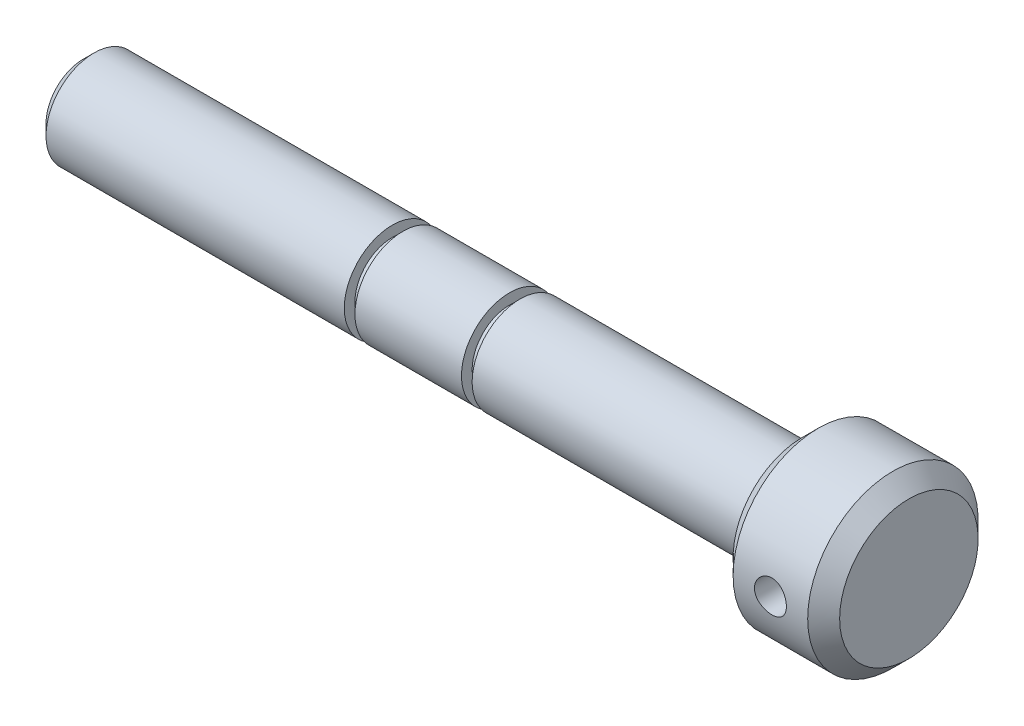
ISO-10303-21;
HEADER;
FILE_DESCRIPTION(('STEP AP214'),'2;1');
FILE_NAME('part.step','',(''),(''),'','','');
FILE_SCHEMA(('AUTOMOTIVE_DESIGN { 1 0 10303 214 1 1 1 1 }'));
ENDSEC;
DATA;
#1=APPLICATION_CONTEXT('core data for automotive mechanical design processes');
#2=APPLICATION_PROTOCOL_DEFINITION('international standard','automotive_design',2000,#1);
#3=PRODUCT_CONTEXT('',#1,'mechanical');
#4=PRODUCT('Part','Part','',(#3));
#5=PRODUCT_RELATED_PRODUCT_CATEGORY('part','',(#4));
#6=PRODUCT_DEFINITION_FORMATION('','',#4);
#7=PRODUCT_DEFINITION_CONTEXT('part definition',#1,'design');
#8=PRODUCT_DEFINITION('design','',#6,#7);
#9=PRODUCT_DEFINITION_SHAPE('','',#8);
#10=(LENGTH_UNIT() NAMED_UNIT(*) SI_UNIT(.MILLI.,.METRE.));
#11=(NAMED_UNIT(*) PLANE_ANGLE_UNIT() SI_UNIT($,.RADIAN.));
#12=(NAMED_UNIT(*) SI_UNIT($,.STERADIAN.) SOLID_ANGLE_UNIT());
#13=UNCERTAINTY_MEASURE_WITH_UNIT(LENGTH_MEASURE(1.E-05),#10,'distance_accuracy_value','');
#14=(GEOMETRIC_REPRESENTATION_CONTEXT(3) GLOBAL_UNCERTAINTY_ASSIGNED_CONTEXT((#13)) GLOBAL_UNIT_ASSIGNED_CONTEXT((#10,
#11,#12)) REPRESENTATION_CONTEXT('',''));
#15=CARTESIAN_POINT('',(0.,0.,0.));
#16=DIRECTION('',(0.,0.,1.));
#17=DIRECTION('',(1.,0.,0.));
#18=AXIS2_PLACEMENT_3D('',#15,#16,#17);
#19=CARTESIAN_POINT('',(155.,0.,0.));
#20=DIRECTION('',(-1.,0.,0.));
#21=DIRECTION('',(0.,0.,1.));
#22=AXIS2_PLACEMENT_3D('',#19,#20,#21);
#23=PLANE('',#22);
#24=CARTESIAN_POINT('',(155.,0.,0.));
#25=DIRECTION('',(-1.,0.,0.));
#26=DIRECTION('',(0.,0.,1.));
#27=AXIS2_PLACEMENT_3D('',#24,#25,#26);
#28=CIRCLE('',#27,13.);
#29=CARTESIAN_POINT('',(155.,0.,13.));
#30=VERTEX_POINT('',#29);
#31=EDGE_CURVE('E58',#30,#30,#28,.F.);
#32=ORIENTED_EDGE('',*,*,#31,.T.);
#33=EDGE_LOOP('',(#32));
#34=FACE_BOUND('',#33,.T.);
#35=ADVANCED_FACE('F39',(#34),#23,.F.);
#36=CARTESIAN_POINT('',(0.,0.,0.));
#37=DIRECTION('',(-1.,0.,0.));
#38=DIRECTION('',(0.,0.,1.));
#39=AXIS2_PLACEMENT_3D('',#36,#37,#38);
#40=CYLINDRICAL_SURFACE('',#39,16.);
#41=CARTESIAN_POINT('',(148.,0.,16.));
#42=CARTESIAN_POINT('',(147.999993620823,-0.16694349293094,15.999996976677));
#43=CARTESIAN_POINT('',(147.986017846761,-0.333969985460194,15.9973601984343));
#44=CARTESIAN_POINT('',(147.930520009763,-0.663316259683594,15.9870957178104));
#45=CARTESIAN_POINT('',(147.888974698721,-0.825631948304452,15.9794638033379));
#46=CARTESIAN_POINT('',(147.779654597481,-1.14074592370361,15.9600627753092));
#47=CARTESIAN_POINT('',(147.711903495095,-1.2935526613707,15.9482973989297));
#48=CARTESIAN_POINT('',(147.552162246154,-1.58561594618802,15.9219142119957));
#49=CARTESIAN_POINT('',(147.46017406171,-1.72487358895465,15.9072966323658));
#50=CARTESIAN_POINT('',(147.253400463993,-1.987567431861,15.8766267286101));
#51=CARTESIAN_POINT('',(147.13838111066,-2.11081791006366,15.860560697127));
#52=CARTESIAN_POINT('',(146.889313381825,-2.33639212270738,15.828906369173));
#53=CARTESIAN_POINT('',(146.755263640461,-2.43871435378483,15.8133181070905));
#54=CARTESIAN_POINT('',(146.470627823272,-2.62029997331585,15.7842510249001));
#55=CARTESIAN_POINT('',(146.319919259366,-2.6993744393921,15.7707898777236));
#56=CARTESIAN_POINT('',(146.007062169646,-2.83101048664565,15.7476942642397));
#57=CARTESIAN_POINT('',(145.844914631778,-2.88357435426196,15.7380594679392));
#58=CARTESIAN_POINT('',(145.515769538171,-2.96010107007,15.723845391491));
#59=CARTESIAN_POINT('',(145.348849805593,-2.98438780384078,15.7192089073281));
#60=CARTESIAN_POINT('',(145.013245230383,-3.00467616190692,15.7153439430552));
#61=CARTESIAN_POINT('',(144.844560547395,-3.00068032270747,15.7161149779752));
#62=CARTESIAN_POINT('',(144.512560949468,-2.96477959204724,15.7229258540351));
#63=CARTESIAN_POINT('',(144.3492045714,-2.93324299992089,15.7288961629467));
#64=CARTESIAN_POINT('',(144.030143160435,-2.84373598792413,15.7453236656933));
#65=CARTESIAN_POINT('',(143.874438452981,-2.78576444478997,15.7557810501903));
#66=CARTESIAN_POINT('',(143.574022641999,-2.64467294358598,15.7800771058518));
#67=CARTESIAN_POINT('',(143.429383058838,-2.5614042706491,15.7939356764673));
#68=CARTESIAN_POINT('',(143.15599054292,-2.37218737860831,15.8234594320584));
#69=CARTESIAN_POINT('',(143.02723922457,-2.26623685778531,15.8391248003104));
#70=CARTESIAN_POINT('',(142.787150088655,-2.03267811370594,15.8708000254433));
#71=CARTESIAN_POINT('',(142.676118695097,-1.90475487372135,15.8868114204806));
#72=CARTESIAN_POINT('',(142.477045518649,-1.63193607419765,15.9171477221664));
#73=CARTESIAN_POINT('',(142.389003966259,-1.48704034451154,15.9314726119049));
#74=CARTESIAN_POINT('',(142.23836449226,-1.18406997774934,15.9568507935502));
#75=CARTESIAN_POINT('',(142.175798441764,-1.02597912889299,15.9678999827258));
#76=CARTESIAN_POINT('',(142.078195813816,-0.701278230797388,15.9854501080544));
#77=CARTESIAN_POINT('',(142.043156311909,-0.534669088555567,15.9919515273599));
#78=CARTESIAN_POINT('',(142.002027937963,-0.200297305806762,15.9996072128396));
#79=CARTESIAN_POINT('',(141.995519216941,-0.0325880252682624,16.0008390182456));
#80=CARTESIAN_POINT('',(142.010510959095,0.301522496184375,15.9980308719646));
#81=CARTESIAN_POINT('',(142.03201004613,0.467923800960776,15.9939911792886));
#82=CARTESIAN_POINT('',(142.102058070367,0.793363146436439,15.9811422300081));
#83=CARTESIAN_POINT('',(142.150394565076,0.952448522092132,15.9723704474806));
#84=CARTESIAN_POINT('',(142.272515413558,1.26025726364927,15.95103684425));
#85=CARTESIAN_POINT('',(142.346301495132,1.40897992519021,15.9384747662267));
#86=CARTESIAN_POINT('',(142.518156256319,1.69363334302643,15.9107606071533));
#87=CARTESIAN_POINT('',(142.616481477074,1.82940655403025,15.8955817234913));
#88=CARTESIAN_POINT('',(142.834276274725,2.0826766465291,15.8643868697942));
#89=CARTESIAN_POINT('',(142.953747826003,2.20017181952174,15.8483708216937));
#90=CARTESIAN_POINT('',(143.212344637823,2.41514591744096,15.817049513949));
#91=CARTESIAN_POINT('',(143.351709816251,2.51233832437154,15.8017565172051));
#92=CARTESIAN_POINT('',(143.645035249048,2.68193350115574,15.7738597115706));
#93=CARTESIAN_POINT('',(143.798994960741,2.75433719227848,15.761255802747));
#94=CARTESIAN_POINT('',(144.116411734485,2.87189347025646,15.7402604841915));
#95=CARTESIAN_POINT('',(144.279818759119,2.91717737589572,15.7318488087376));
#96=CARTESIAN_POINT('',(144.612094445043,2.97961358652471,15.7201440760483));
#97=CARTESIAN_POINT('',(144.780962487941,2.99676906541416,15.7168504413158));
#98=CARTESIAN_POINT('',(145.116496662883,3.00235524296709,15.7157839960771));
#99=CARTESIAN_POINT('',(145.283155161914,2.99123790006997,15.7179243194859));
#100=CARTESIAN_POINT('',(145.612182844091,2.94158350757605,15.7272920132));
#101=CARTESIAN_POINT('',(145.774552052855,2.90304662178663,15.7345193531149));
#102=CARTESIAN_POINT('',(146.090148969591,2.79983775166526,15.7532101604636));
#103=CARTESIAN_POINT('',(146.243393182692,2.73521470794505,15.7646656918993));
#104=CARTESIAN_POINT('',(146.536936508482,2.58171737824409,15.7905277510368));
#105=CARTESIAN_POINT('',(146.67723470569,2.49284137896372,15.8049344872024));
#106=CARTESIAN_POINT('',(146.943167360085,2.29178974679071,15.8353453221549));
#107=CARTESIAN_POINT('',(147.068550825134,2.17928519728607,15.8513701070609));
#108=CARTESIAN_POINT('',(147.298810324929,1.93485585348458,15.8830566783747));
#109=CARTESIAN_POINT('',(147.40368164196,1.80292660378324,15.8987183805466));
#110=CARTESIAN_POINT('',(147.590821905254,1.52196989014375,15.928079519361));
#111=CARTESIAN_POINT('',(147.672878856981,1.37279918128104,15.9417600198112));
#112=CARTESIAN_POINT('',(147.81063527321,1.06258022730767,15.9654323876137));
#113=CARTESIAN_POINT('',(147.866359494094,0.901543303410504,15.9754277175807));
#114=CARTESIAN_POINT('',(147.938554628837,0.616694405650313,15.9885658141526));
#115=CARTESIAN_POINT('',(147.961557260626,0.494547620503744,15.9928294175641));
#116=CARTESIAN_POINT('',(147.992282124233,0.248282494230316,15.9985475990802));
#117=CARTESIAN_POINT('',(148.000004744512,0.124164203305419,16.0000022485961));
#118=CARTESIAN_POINT('',(148.,0.,16.));
#119=B_SPLINE_CURVE_WITH_KNOTS('',3,(#41,#42,#43,#44,#45,#46,#47,#48,#49,#50,#51,#52,#53,#54,
#55,#56,#57,#58,#59,#60,#61,#62,#63,#64,#65,#66,#67,#68,#69,#70,#71,#72,#73,#74,#75,#76,#77,#78,
#79,#80,#81,#82,#83,#84,#85,#86,#87,#88,#89,#90,#91,#92,#93,#94,#95,#96,#97,#98,#99,#100,#101,
#102,#103,#104,#105,#106,#107,#108,#109,#110,#111,#112,#113,#114,#115,#116,#117,#118),
.UNSPECIFIED.,.T.,.F.,(4,2,2,2,2,2,2,2,2,2,2,2,2,2,2,2,2,2,2,2,2,2,2,2,2,2,2,2,2,2,2,2,2,2,2,2,
2,2,4),(0.,0.500376401929849,1.00117528507091,1.50152254246183,2.00182930673783,2.5075023602726,
3.01321172567233,3.52292381008715,4.03259192623896,4.53636302890675,5.04008895174515,
5.53718001225533,6.03429219693573,6.5343852525906,7.03452908099719,7.54255536928153,
8.05058675089894,8.55925176643395,9.0678627334749,9.56896348152192,10.0700396092917,
10.5672046781566,11.0644035067606,11.5670355603542,12.069714568262,12.579068739746,
13.0884039790989,13.5952525563712,14.1020439389303,14.6007850446349,15.0995231708301,
15.5973299241538,16.0951718531084,16.6004673993276,17.1058790252451,17.6158409783262,
18.1253225386234,18.4974868904881,18.8696417807908),.UNSPECIFIED.);
#120=CARTESIAN_POINT('',(148.,0.,16.));
#121=VERTEX_POINT('',#120);
#122=EDGE_CURVE('E44',#121,#121,#119,.T.);
#123=ORIENTED_EDGE('',*,*,#122,.T.);
#124=EDGE_LOOP('',(#123));
#125=FACE_BOUND('',#124,.T.);
#126=CARTESIAN_POINT('',(148.,0.,-16.));
#127=CARTESIAN_POINT('',(147.999993620823,0.166943492930942,-15.999996976677));
#128=CARTESIAN_POINT('',(147.986017846761,0.333969985460198,-15.9973601984343));
#129=CARTESIAN_POINT('',(147.930520009763,0.663316259683596,-15.9870957178104));
#130=CARTESIAN_POINT('',(147.888974698721,0.825631948304452,-15.9794638033379));
#131=CARTESIAN_POINT('',(147.779654597481,1.1407459237036,-15.9600627753092));
#132=CARTESIAN_POINT('',(147.711903495095,1.29355266137068,-15.9482973989297));
#133=CARTESIAN_POINT('',(147.552162246154,1.58561594618801,-15.9219142119957));
#134=CARTESIAN_POINT('',(147.46017406171,1.72487358895465,-15.9072966323658));
#135=CARTESIAN_POINT('',(147.253400463993,1.987567431861,-15.8766267286101));
#136=CARTESIAN_POINT('',(147.13838111066,2.11081791006366,-15.860560697127));
#137=CARTESIAN_POINT('',(146.889313381825,2.33639212270737,-15.828906369173));
#138=CARTESIAN_POINT('',(146.755263640461,2.43871435378482,-15.8133181070906));
#139=CARTESIAN_POINT('',(146.470627823272,2.62029997331585,-15.7842510249001));
#140=CARTESIAN_POINT('',(146.319919259366,2.6993744393921,-15.7707898777236));
#141=CARTESIAN_POINT('',(146.007062169646,2.83101048664565,-15.7476942642397));
#142=CARTESIAN_POINT('',(145.844914631778,2.88357435426196,-15.7380594679392));
#143=CARTESIAN_POINT('',(145.515769538171,2.96010107007,-15.723845391491));
#144=CARTESIAN_POINT('',(145.348849805593,2.98438780384077,-15.7192089073281));
#145=CARTESIAN_POINT('',(145.013245230383,3.00467616190692,-15.7153439430552));
#146=CARTESIAN_POINT('',(144.844560547395,3.00068032270747,-15.7161149779752));
#147=CARTESIAN_POINT('',(144.512560949468,2.96477959204724,-15.7229258540351));
#148=CARTESIAN_POINT('',(144.3492045714,2.93324299992089,-15.7288961629467));
#149=CARTESIAN_POINT('',(144.030143160435,2.84373598792413,-15.7453236656933));
#150=CARTESIAN_POINT('',(143.874438452981,2.78576444478997,-15.7557810501903));
#151=CARTESIAN_POINT('',(143.574022641999,2.64467294358598,-15.7800771058518));
#152=CARTESIAN_POINT('',(143.429383058838,2.5614042706491,-15.7939356764673));
#153=CARTESIAN_POINT('',(143.15599054292,2.37218737860831,-15.8234594320584));
#154=CARTESIAN_POINT('',(143.02723922457,2.26623685778531,-15.8391248003104));
#155=CARTESIAN_POINT('',(142.787150088655,2.03267811370594,-15.8708000254433));
#156=CARTESIAN_POINT('',(142.676118695097,1.90475487372135,-15.8868114204806));
#157=CARTESIAN_POINT('',(142.477045518649,1.63193607419765,-15.9171477221664));
#158=CARTESIAN_POINT('',(142.389003966259,1.48704034451154,-15.9314726119049));
#159=CARTESIAN_POINT('',(142.23836449226,1.18406997774934,-15.9568507935502));
#160=CARTESIAN_POINT('',(142.175798441764,1.02597912889299,-15.9678999827258));
#161=CARTESIAN_POINT('',(142.078195813816,0.701278230797388,-15.9854501080544));
#162=CARTESIAN_POINT('',(142.043156311909,0.534669088555566,-15.9919515273599));
#163=CARTESIAN_POINT('',(142.002027937963,0.200297305806761,-15.9996072128396));
#164=CARTESIAN_POINT('',(141.995519216941,0.0325880252682618,-16.0008390182456));
#165=CARTESIAN_POINT('',(142.010510959095,-0.301522496184374,-15.9980308719646));
#166=CARTESIAN_POINT('',(142.03201004613,-0.467923800960774,-15.9939911792886));
#167=CARTESIAN_POINT('',(142.102058070367,-0.793363146436436,-15.9811422300081));
#168=CARTESIAN_POINT('',(142.150394565076,-0.952448522092128,-15.9723704474806));
#169=CARTESIAN_POINT('',(142.272515413558,-1.26025726364926,-15.95103684425));
#170=CARTESIAN_POINT('',(142.346301495132,-1.4089799251902,-15.9384747662267));
#171=CARTESIAN_POINT('',(142.518156256319,-1.69363334302642,-15.9107606071533));
#172=CARTESIAN_POINT('',(142.616481477074,-1.82940655403024,-15.8955817234913));
#173=CARTESIAN_POINT('',(142.834276274725,-2.08267664652909,-15.8643868697942));
#174=CARTESIAN_POINT('',(142.953747826003,-2.20017181952173,-15.8483708216937));
#175=CARTESIAN_POINT('',(143.212344637823,-2.41514591744095,-15.817049513949));
#176=CARTESIAN_POINT('',(143.351709816251,-2.51233832437153,-15.8017565172051));
#177=CARTESIAN_POINT('',(143.645035249048,-2.68193350115573,-15.7738597115706));
#178=CARTESIAN_POINT('',(143.798994960741,-2.75433719227848,-15.761255802747));
#179=CARTESIAN_POINT('',(144.116411734485,-2.87189347025646,-15.7402604841915));
#180=CARTESIAN_POINT('',(144.279818759119,-2.91717737589572,-15.7318488087376));
#181=CARTESIAN_POINT('',(144.612094445043,-2.9796135865247,-15.7201440760483));
#182=CARTESIAN_POINT('',(144.780962487941,-2.99676906541416,-15.7168504413158));
#183=CARTESIAN_POINT('',(145.116496662883,-3.00235524296709,-15.7157839960771));
#184=CARTESIAN_POINT('',(145.283155161914,-2.99123790006997,-15.7179243194859));
#185=CARTESIAN_POINT('',(145.612182844091,-2.94158350757605,-15.7272920132));
#186=CARTESIAN_POINT('',(145.774552052855,-2.90304662178664,-15.7345193531149));
#187=CARTESIAN_POINT('',(146.090148969591,-2.79983775166526,-15.7532101604636));
#188=CARTESIAN_POINT('',(146.243393182692,-2.73521470794505,-15.7646656918993));
#189=CARTESIAN_POINT('',(146.536936508482,-2.58171737824409,-15.7905277510368));
#190=CARTESIAN_POINT('',(146.67723470569,-2.49284137896372,-15.8049344872024));
#191=CARTESIAN_POINT('',(146.943167360085,-2.29178974679071,-15.8353453221549));
#192=CARTESIAN_POINT('',(147.068550825134,-2.17928519728607,-15.8513701070609));
#193=CARTESIAN_POINT('',(147.298810324929,-1.93485585348458,-15.8830566783747));
#194=CARTESIAN_POINT('',(147.40368164196,-1.80292660378324,-15.8987183805466));
#195=CARTESIAN_POINT('',(147.590821905254,-1.52196989014375,-15.928079519361));
#196=CARTESIAN_POINT('',(147.672878856981,-1.37279918128103,-15.9417600198112));
#197=CARTESIAN_POINT('',(147.81063527321,-1.06258022730766,-15.9654323876137));
#198=CARTESIAN_POINT('',(147.866359494094,-0.901543303410496,-15.9754277175807));
#199=CARTESIAN_POINT('',(147.938554628837,-0.616694405650312,-15.9885658141526));
#200=CARTESIAN_POINT('',(147.961557260626,-0.494547620503743,-15.9928294175641));
#201=CARTESIAN_POINT('',(147.992282124233,-0.248282494230315,-15.9985475990802));
#202=CARTESIAN_POINT('',(148.000004744512,-0.124164203305419,-16.0000022485961));
#203=CARTESIAN_POINT('',(148.,0.,-16.));
#204=B_SPLINE_CURVE_WITH_KNOTS('',3,(#126,#127,#128,#129,#130,#131,#132,#133,#134,#135,#136,
#137,#138,#139,#140,#141,#142,#143,#144,#145,#146,#147,#148,#149,#150,#151,#152,#153,#154,#155,
#156,#157,#158,#159,#160,#161,#162,#163,#164,#165,#166,#167,#168,#169,#170,#171,#172,#173,#174,
#175,#176,#177,#178,#179,#180,#181,#182,#183,#184,#185,#186,#187,#188,#189,#190,#191,#192,#193,
#194,#195,#196,#197,#198,#199,#200,#201,#202,#203),.UNSPECIFIED.,.T.,.F.,(4,2,2,2,2,2,2,2,2,2,2,
2,2,2,2,2,2,2,2,2,2,2,2,2,2,2,2,2,2,2,2,2,2,2,2,2,2,2,4),(0.,0.500376401929852,1.0011752850709,
1.50152254246181,2.00182930673781,2.5075023602726,3.01321172567233,3.52292381008715,
4.03259192623896,4.53636302890669,5.04008895174512,5.53718001225533,6.03429219693573,
6.5343852525906,7.03452908099719,7.54255536928153,8.05058675089894,8.55925176643395,
9.0678627334749,9.56896348152192,10.0700396092917,10.5672046781565,11.0644035067606,
11.5670355603542,12.0697145682619,12.579068739746,13.0884039790989,13.5952525563712,
14.1020439389302,14.6007850446349,15.0995231708301,15.5973299241538,16.0951718531084,
16.6004673993276,17.1058790252451,17.6158409783263,18.1253225386234,18.4974868904881,
18.8696417807908),.UNSPECIFIED.);
#205=CARTESIAN_POINT('',(148.,0.,-16.));
#206=VERTEX_POINT('',#205);
#207=EDGE_CURVE('E61',#206,#206,#204,.T.);
#208=ORIENTED_EDGE('',*,*,#207,.T.);
#209=EDGE_LOOP('',(#208));
#210=FACE_BOUND('',#209,.T.);
#211=CARTESIAN_POINT('',(138.,0.,0.));
#212=DIRECTION('',(1.,0.,0.));
#213=DIRECTION('',(0.,0.,-1.));
#214=AXIS2_PLACEMENT_3D('',#211,#212,#213);
#215=CIRCLE('',#214,16.);
#216=CARTESIAN_POINT('',(138.,0.,-16.));
#217=VERTEX_POINT('',#216);
#218=EDGE_CURVE('E151',#217,#217,#215,.T.);
#219=ORIENTED_EDGE('',*,*,#218,.T.);
#220=EDGE_LOOP('',(#219));
#221=FACE_BOUND('',#220,.T.);
#222=CARTESIAN_POINT('',(152.,0.,0.));
#223=DIRECTION('',(-1.,0.,0.));
#224=DIRECTION('',(0.,0.,1.));
#225=AXIS2_PLACEMENT_3D('',#222,#223,#224);
#226=CIRCLE('',#225,16.);
#227=CARTESIAN_POINT('',(152.,0.,16.));
#228=VERTEX_POINT('',#227);
#229=EDGE_CURVE('E149',#228,#228,#226,.T.);
#230=ORIENTED_EDGE('',*,*,#229,.T.);
#231=EDGE_LOOP('',(#230));
#232=FACE_BOUND('',#231,.T.);
#233=ADVANCED_FACE('F66',(#125,#210,#221,#232),#40,.T.);
#234=CARTESIAN_POINT('',(135.,16.,0.));
#235=DIRECTION('',(1.,0.,0.));
#236=DIRECTION('',(0.,0.,-1.));
#237=AXIS2_PLACEMENT_3D('',#234,#235,#236);
#238=PLANE('',#237);
#239=CARTESIAN_POINT('',(135.,0.,0.));
#240=DIRECTION('',(1.,0.,0.));
#241=DIRECTION('',(0.,0.,-1.));
#242=AXIS2_PLACEMENT_3D('',#239,#240,#241);
#243=CIRCLE('',#242,12.9999999999999);
#244=CARTESIAN_POINT('',(135.,0.,-12.9999999999999));
#245=VERTEX_POINT('',#244);
#246=EDGE_CURVE('E152',#245,#245,#243,.F.);
#247=ORIENTED_EDGE('',*,*,#246,.T.);
#248=EDGE_LOOP('',(#247));
#249=FACE_BOUND('',#248,.T.);
#250=CARTESIAN_POINT('',(135.,0.,0.));
#251=DIRECTION('',(-1.,0.,0.));
#252=DIRECTION('',(0.,0.,1.));
#253=AXIS2_PLACEMENT_3D('',#250,#251,#252);
#254=CIRCLE('',#253,9.);
#255=CARTESIAN_POINT('',(135.,0.,9.));
#256=VERTEX_POINT('',#255);
#257=EDGE_CURVE('E156',#256,#256,#254,.T.);
#258=ORIENTED_EDGE('',*,*,#257,.F.);
#259=EDGE_LOOP('',(#258));
#260=FACE_BOUND('',#259,.T.);
#261=ADVANCED_FACE('F114',(#249,#260),#238,.F.);
#262=CARTESIAN_POINT('',(0.,0.,0.));
#263=DIRECTION('',(-1.,0.,0.));
#264=DIRECTION('',(0.,0.,1.));
#265=AXIS2_PLACEMENT_3D('',#262,#263,#264);
#266=CYLINDRICAL_SURFACE('',#265,9.);
#267=CARTESIAN_POINT('',(82.,0.,0.));
#268=DIRECTION('',(-1.,0.,0.));
#269=DIRECTION('',(0.,0.,1.));
#270=AXIS2_PLACEMENT_3D('',#267,#268,#269);
#271=CIRCLE('',#270,8.99999999999999);
#272=CARTESIAN_POINT('',(82.,0.,8.99999999999999));
#273=VERTEX_POINT('',#272);
#274=EDGE_CURVE('E161',#273,#273,#271,.T.);
#275=ORIENTED_EDGE('',*,*,#274,.F.);
#276=EDGE_LOOP('',(#275));
#277=FACE_BOUND('',#276,.T.);
#278=ORIENTED_EDGE('',*,*,#257,.T.);
#279=EDGE_LOOP('',(#278));
#280=FACE_BOUND('',#279,.T.);
#281=ADVANCED_FACE('F111',(#277,#280),#266,.T.);
#282=CARTESIAN_POINT('',(82.,8.99999999999999,0.));
#283=DIRECTION('',(1.,0.,0.));
#284=DIRECTION('',(0.,0.,-1.));
#285=AXIS2_PLACEMENT_3D('',#282,#283,#284);
#286=PLANE('',#285);
#287=CARTESIAN_POINT('',(82.,0.,0.));
#288=DIRECTION('',(-1.,0.,0.));
#289=DIRECTION('',(0.,0.,1.));
#290=AXIS2_PLACEMENT_3D('',#287,#288,#289);
#291=CIRCLE('',#290,7.);
#292=CARTESIAN_POINT('',(82.,0.,7.));
#293=VERTEX_POINT('',#292);
#294=EDGE_CURVE('E164',#293,#293,#291,.T.);
#295=ORIENTED_EDGE('',*,*,#294,.F.);
#296=EDGE_LOOP('',(#295));
#297=FACE_BOUND('',#296,.T.);
#298=ORIENTED_EDGE('',*,*,#274,.T.);
#299=EDGE_LOOP('',(#298));
#300=FACE_BOUND('',#299,.T.);
#301=ADVANCED_FACE('F107',(#297,#300),#286,.F.);
#302=CARTESIAN_POINT('',(0.,0.,0.));
#303=DIRECTION('',(-1.,0.,0.));
#304=DIRECTION('',(0.,0.,1.));
#305=AXIS2_PLACEMENT_3D('',#302,#303,#304);
#306=CYLINDRICAL_SURFACE('',#305,7.);
#307=CARTESIAN_POINT('',(80.,0.,0.));
#308=DIRECTION('',(-1.,0.,0.));
#309=DIRECTION('',(0.,0.,1.));
#310=AXIS2_PLACEMENT_3D('',#307,#308,#309);
#311=CIRCLE('',#310,7.);
#312=CARTESIAN_POINT('',(80.,0.,7.));
#313=VERTEX_POINT('',#312);
#314=EDGE_CURVE('E167',#313,#313,#311,.T.);
#315=ORIENTED_EDGE('',*,*,#314,.F.);
#316=EDGE_LOOP('',(#315));
#317=FACE_BOUND('',#316,.T.);
#318=ORIENTED_EDGE('',*,*,#294,.T.);
#319=EDGE_LOOP('',(#318));
#320=FACE_BOUND('',#319,.T.);
#321=ADVANCED_FACE('F103',(#317,#320),#306,.T.);
#322=CARTESIAN_POINT('',(80.,7.,0.));
#323=DIRECTION('',(-1.,0.,0.));
#324=DIRECTION('',(0.,0.,1.));
#325=AXIS2_PLACEMENT_3D('',#322,#323,#324);
#326=PLANE('',#325);
#327=CARTESIAN_POINT('',(80.,0.,0.));
#328=DIRECTION('',(-1.,0.,0.));
#329=DIRECTION('',(0.,0.,1.));
#330=AXIS2_PLACEMENT_3D('',#327,#328,#329);
#331=CIRCLE('',#330,9.);
#332=CARTESIAN_POINT('',(80.,0.,9.));
#333=VERTEX_POINT('',#332);
#334=EDGE_CURVE('E170',#333,#333,#331,.T.);
#335=ORIENTED_EDGE('',*,*,#334,.F.);
#336=EDGE_LOOP('',(#335));
#337=FACE_BOUND('',#336,.T.);
#338=ORIENTED_EDGE('',*,*,#314,.T.);
#339=EDGE_LOOP('',(#338));
#340=FACE_BOUND('',#339,.T.);
#341=ADVANCED_FACE('F99',(#337,#340),#326,.F.);
#342=CARTESIAN_POINT('',(0.,0.,0.));
#343=DIRECTION('',(-1.,0.,0.));
#344=DIRECTION('',(0.,0.,1.));
#345=AXIS2_PLACEMENT_3D('',#342,#343,#344);
#346=CYLINDRICAL_SURFACE('',#345,9.);
#347=CARTESIAN_POINT('',(60.,0.,0.));
#348=DIRECTION('',(-1.,0.,0.));
#349=DIRECTION('',(0.,0.,1.));
#350=AXIS2_PLACEMENT_3D('',#347,#348,#349);
#351=CIRCLE('',#350,9.);
#352=CARTESIAN_POINT('',(60.,0.,9.));
#353=VERTEX_POINT('',#352);
#354=EDGE_CURVE('E173',#353,#353,#351,.T.);
#355=ORIENTED_EDGE('',*,*,#354,.F.);
#356=EDGE_LOOP('',(#355));
#357=FACE_BOUND('',#356,.T.);
#358=ORIENTED_EDGE('',*,*,#334,.T.);
#359=EDGE_LOOP('',(#358));
#360=FACE_BOUND('',#359,.T.);
#361=ADVANCED_FACE('F95',(#357,#360),#346,.T.);
#362=CARTESIAN_POINT('',(60.,9.,0.));
#363=DIRECTION('',(1.,0.,0.));
#364=DIRECTION('',(0.,0.,-1.));
#365=AXIS2_PLACEMENT_3D('',#362,#363,#364);
#366=PLANE('',#365);
#367=CARTESIAN_POINT('',(60.,0.,0.));
#368=DIRECTION('',(-1.,0.,0.));
#369=DIRECTION('',(0.,0.,1.));
#370=AXIS2_PLACEMENT_3D('',#367,#368,#369);
#371=CIRCLE('',#370,7.);
#372=CARTESIAN_POINT('',(60.,0.,7.));
#373=VERTEX_POINT('',#372);
#374=EDGE_CURVE('E176',#373,#373,#371,.T.);
#375=ORIENTED_EDGE('',*,*,#374,.F.);
#376=EDGE_LOOP('',(#375));
#377=FACE_BOUND('',#376,.T.);
#378=ORIENTED_EDGE('',*,*,#354,.T.);
#379=EDGE_LOOP('',(#378));
#380=FACE_BOUND('',#379,.T.);
#381=ADVANCED_FACE('F91',(#377,#380),#366,.F.);
#382=CARTESIAN_POINT('',(0.,0.,0.));
#383=DIRECTION('',(-1.,0.,0.));
#384=DIRECTION('',(0.,0.,1.));
#385=AXIS2_PLACEMENT_3D('',#382,#383,#384);
#386=CYLINDRICAL_SURFACE('',#385,7.);
#387=CARTESIAN_POINT('',(58.,0.,0.));
#388=DIRECTION('',(-1.,0.,0.));
#389=DIRECTION('',(0.,0.,1.));
#390=AXIS2_PLACEMENT_3D('',#387,#388,#389);
#391=CIRCLE('',#390,7.);
#392=CARTESIAN_POINT('',(58.,0.,7.));
#393=VERTEX_POINT('',#392);
#394=EDGE_CURVE('E179',#393,#393,#391,.T.);
#395=ORIENTED_EDGE('',*,*,#394,.F.);
#396=EDGE_LOOP('',(#395));
#397=FACE_BOUND('',#396,.T.);
#398=ORIENTED_EDGE('',*,*,#374,.T.);
#399=EDGE_LOOP('',(#398));
#400=FACE_BOUND('',#399,.T.);
#401=ADVANCED_FACE('F87',(#397,#400),#386,.T.);
#402=CARTESIAN_POINT('',(58.,7.,0.));
#403=DIRECTION('',(-1.,0.,0.));
#404=DIRECTION('',(0.,0.,1.));
#405=AXIS2_PLACEMENT_3D('',#402,#403,#404);
#406=PLANE('',#405);
#407=CARTESIAN_POINT('',(58.,0.,0.));
#408=DIRECTION('',(-1.,0.,0.));
#409=DIRECTION('',(0.,0.,1.));
#410=AXIS2_PLACEMENT_3D('',#407,#408,#409);
#411=CIRCLE('',#410,9.00000000000001);
#412=CARTESIAN_POINT('',(58.,0.,9.00000000000001));
#413=VERTEX_POINT('',#412);
#414=EDGE_CURVE('E182',#413,#413,#411,.T.);
#415=ORIENTED_EDGE('',*,*,#414,.F.);
#416=EDGE_LOOP('',(#415));
#417=FACE_BOUND('',#416,.T.);
#418=ORIENTED_EDGE('',*,*,#394,.T.);
#419=EDGE_LOOP('',(#418));
#420=FACE_BOUND('',#419,.T.);
#421=ADVANCED_FACE('F84',(#417,#420),#406,.F.);
#422=CARTESIAN_POINT('',(0.,0.,0.));
#423=DIRECTION('',(-1.,0.,0.));
#424=DIRECTION('',(0.,0.,1.));
#425=AXIS2_PLACEMENT_3D('',#422,#423,#424);
#426=CYLINDRICAL_SURFACE('',#425,9.);
#427=CARTESIAN_POINT('',(1.99999999999999,0.,0.));
#428=DIRECTION('',(1.,0.,0.));
#429=DIRECTION('',(0.,0.,-1.));
#430=AXIS2_PLACEMENT_3D('',#427,#428,#429);
#431=CIRCLE('',#430,9.);
#432=CARTESIAN_POINT('',(1.99999999999999,0.,-9.));
#433=VERTEX_POINT('',#432);
#434=EDGE_CURVE('E10',#433,#433,#431,.T.);
#435=ORIENTED_EDGE('',*,*,#434,.T.);
#436=EDGE_LOOP('',(#435));
#437=FACE_BOUND('',#436,.T.);
#438=ORIENTED_EDGE('',*,*,#414,.T.);
#439=EDGE_LOOP('',(#438));
#440=FACE_BOUND('',#439,.T.);
#441=ADVANCED_FACE('F80',(#437,#440),#426,.T.);
#442=CARTESIAN_POINT('',(0.,9.,0.));
#443=DIRECTION('',(1.,0.,0.));
#444=DIRECTION('',(0.,0.,-1.));
#445=AXIS2_PLACEMENT_3D('',#442,#443,#444);
#446=PLANE('',#445);
#447=CARTESIAN_POINT('',(0.,0.,0.));
#448=DIRECTION('',(1.,0.,0.));
#449=DIRECTION('',(0.,0.,-1.));
#450=AXIS2_PLACEMENT_3D('',#447,#448,#449);
#451=CIRCLE('',#450,7.00000000000003);
#452=CARTESIAN_POINT('',(0.,0.,-7.00000000000003));
#453=VERTEX_POINT('',#452);
#454=EDGE_CURVE('E53',#453,#453,#451,.F.);
#455=ORIENTED_EDGE('',*,*,#454,.T.);
#456=EDGE_LOOP('',(#455));
#457=FACE_BOUND('',#456,.T.);
#458=ADVANCED_FACE('F75',(#457),#446,.F.);
#459=CARTESIAN_POINT('',(135.,0.,0.));
#460=DIRECTION('',(1.,0.,0.));
#461=DIRECTION('',(0.,0.,-1.));
#462=AXIS2_PLACEMENT_3D('',#459,#460,#461);
#463=CONICAL_SURFACE('',#462,12.9999999999999,0.785398163397452);
#464=ORIENTED_EDGE('',*,*,#218,.F.);
#465=EDGE_LOOP('',(#464));
#466=FACE_BOUND('',#465,.T.);
#467=ORIENTED_EDGE('',*,*,#246,.F.);
#468=EDGE_LOOP('',(#467));
#469=FACE_BOUND('',#468,.T.);
#470=ADVANCED_FACE('F79',(#466,#469),#463,.T.);
#471=CARTESIAN_POINT('',(152.,0.,0.));
#472=DIRECTION('',(-1.,0.,0.));
#473=DIRECTION('',(0.,0.,1.));
#474=AXIS2_PLACEMENT_3D('',#471,#472,#473);
#475=CONICAL_SURFACE('',#474,16.,0.785398163397445);
#476=CARTESIAN_POINT('',(155.,0.,13.));
#477=CARTESIAN_POINT('',(154.96875,0.,13.03125));
#478=CARTESIAN_POINT('',(154.9375,0.,13.0625));
#479=CARTESIAN_POINT('',(154.875,0.,13.125));
#480=CARTESIAN_POINT('',(154.84375,0.,13.15625));
#481=CARTESIAN_POINT('',(154.78125,0.,13.21875));
#482=CARTESIAN_POINT('',(154.75,0.,13.25));
#483=CARTESIAN_POINT('',(154.6875,0.,13.3125));
#484=CARTESIAN_POINT('',(154.65625,0.,13.34375));
#485=CARTESIAN_POINT('',(154.59375,0.,13.40625));
#486=CARTESIAN_POINT('',(154.5625,0.,13.4375));
#487=CARTESIAN_POINT('',(154.5,0.,13.5));
#488=CARTESIAN_POINT('',(154.46875,0.,13.53125));
#489=CARTESIAN_POINT('',(154.40625,0.,13.59375));
#490=CARTESIAN_POINT('',(154.375,0.,13.625));
#491=CARTESIAN_POINT('',(154.3125,0.,13.6875));
#492=CARTESIAN_POINT('',(154.28125,0.,13.71875));
#493=CARTESIAN_POINT('',(154.21875,0.,13.78125));
#494=CARTESIAN_POINT('',(154.1875,0.,13.8125));
#495=CARTESIAN_POINT('',(154.125,0.,13.875));
#496=CARTESIAN_POINT('',(154.09375,0.,13.90625));
#497=CARTESIAN_POINT('',(154.03125,0.,13.96875));
#498=CARTESIAN_POINT('',(154.,0.,14.));
#499=CARTESIAN_POINT('',(153.9375,0.,14.0625));
#500=CARTESIAN_POINT('',(153.90625,0.,14.09375));
#501=CARTESIAN_POINT('',(153.84375,0.,14.15625));
#502=CARTESIAN_POINT('',(153.8125,0.,14.1875));
#503=CARTESIAN_POINT('',(153.75,0.,14.25));
#504=CARTESIAN_POINT('',(153.71875,0.,14.28125));
#505=CARTESIAN_POINT('',(153.65625,0.,14.34375));
#506=CARTESIAN_POINT('',(153.625,0.,14.375));
#507=CARTESIAN_POINT('',(153.5625,0.,14.4375));
#508=CARTESIAN_POINT('',(153.53125,0.,14.46875));
#509=CARTESIAN_POINT('',(153.46875,0.,14.53125));
#510=CARTESIAN_POINT('',(153.4375,0.,14.5625));
#511=CARTESIAN_POINT('',(153.375,0.,14.625));
#512=CARTESIAN_POINT('',(153.34375,0.,14.65625));
#513=CARTESIAN_POINT('',(153.28125,0.,14.71875));
#514=CARTESIAN_POINT('',(153.25,0.,14.75));
#515=CARTESIAN_POINT('',(153.1875,0.,14.8125));
#516=CARTESIAN_POINT('',(153.15625,0.,14.84375));
#517=CARTESIAN_POINT('',(153.09375,0.,14.90625));
#518=CARTESIAN_POINT('',(153.0625,0.,14.9375));
#519=CARTESIAN_POINT('',(153.,0.,15.));
#520=CARTESIAN_POINT('',(152.96875,0.,15.03125));
#521=CARTESIAN_POINT('',(152.90625,0.,15.09375));
#522=CARTESIAN_POINT('',(152.875,0.,15.125));
#523=CARTESIAN_POINT('',(152.8125,0.,15.1875));
#524=CARTESIAN_POINT('',(152.78125,0.,15.21875));
#525=CARTESIAN_POINT('',(152.71875,0.,15.28125));
#526=CARTESIAN_POINT('',(152.6875,0.,15.3125));
#527=CARTESIAN_POINT('',(152.625,0.,15.375));
#528=CARTESIAN_POINT('',(152.59375,0.,15.40625));
#529=CARTESIAN_POINT('',(152.53125,0.,15.46875));
#530=CARTESIAN_POINT('',(152.5,0.,15.5));
#531=CARTESIAN_POINT('',(152.4375,0.,15.5625));
#532=CARTESIAN_POINT('',(152.40625,0.,15.59375));
#533=CARTESIAN_POINT('',(152.34375,0.,15.65625));
#534=CARTESIAN_POINT('',(152.3125,0.,15.6875));
#535=CARTESIAN_POINT('',(152.25,0.,15.75));
#536=CARTESIAN_POINT('',(152.21875,0.,15.78125));
#537=CARTESIAN_POINT('',(152.15625,0.,15.84375));
#538=CARTESIAN_POINT('',(152.125,0.,15.875));
#539=CARTESIAN_POINT('',(152.0625,0.,15.9375));
#540=CARTESIAN_POINT('',(152.03125,0.,15.96875));
#541=CARTESIAN_POINT('',(152.,0.,16.));
#542=B_SPLINE_CURVE_WITH_KNOTS('',3,(#476,#477,#478,#479,#480,#481,#482,#483,#484,#485,#486,
#487,#488,#489,#490,#491,#492,#493,#494,#495,#496,#497,#498,#499,#500,#501,#502,#503,#504,#505,
#506,#507,#508,#509,#510,#511,#512,#513,#514,#515,#516,#517,#518,#519,#520,#521,#522,#523,#524,
#525,#526,#527,#528,#529,#530,#531,#532,#533,#534,#535,#536,#537,#538,#539,#540,#541),
.UNSPECIFIED.,.F.,.F.,(4,2,2,2,2,2,2,2,2,2,2,2,2,2,2,2,2,2,2,2,2,2,2,2,2,2,2,2,2,2,2,2,4),(0.,
0.132582521472459,0.265165042944938,0.397747564417419,0.530330085889898,0.662912607362377,
0.795495128834856,0.928077650307315,1.0606601717798,1.19324269325227,1.32582521472475,
1.45840773619723,1.59099025766971,1.72357277914217,1.85615530061465,1.98873782208713,
2.12132034355961,2.25390286503209,2.38648538650457,2.51906790797705,2.65165042944951,
2.78423295092198,2.91681547239446,3.04939799386694,3.18198051533942,3.3145630368119,
3.44714555828436,3.57972807975684,3.71231060122932,3.8448931227018,3.97747564417428,
4.11005816564676,4.24264068711924),.UNSPECIFIED.);
#543=EDGE_CURVE('BSEAM135',#30,#228,#542,.T.);
#544=ORIENTED_EDGE('',*,*,#31,.F.);
#545=ORIENTED_EDGE('',*,*,#229,.F.);
#546=ORIENTED_EDGE('',*,*,#543,.T.);
#547=ORIENTED_EDGE('',*,*,#543,.F.);
#548=EDGE_LOOP('',(#544,#546,#545,#547));
#549=FACE_BOUND('',#548,.T.);
#550=ADVANCED_FACE('F135',(#549),#475,.T.);
#551=CARTESIAN_POINT('',(0.,0.,0.));
#552=DIRECTION('',(1.,0.,0.));
#553=DIRECTION('',(0.,0.,-1.));
#554=AXIS2_PLACEMENT_3D('',#551,#552,#553);
#555=CONICAL_SURFACE('',#554,7.00000000000003,0.785398163397444);
#556=ORIENTED_EDGE('',*,*,#434,.F.);
#557=EDGE_LOOP('',(#556));
#558=FACE_BOUND('',#557,.T.);
#559=ORIENTED_EDGE('',*,*,#454,.F.);
#560=EDGE_LOOP('',(#559));
#561=FACE_BOUND('',#560,.T.);
#562=ADVANCED_FACE('F42',(#558,#561),#555,.T.);
#563=CARTESIAN_POINT('',(145.,0.,-200.));
#564=DIRECTION('',(0.,0.,1.));
#565=DIRECTION('',(1.,0.,0.));
#566=AXIS2_PLACEMENT_3D('',#563,#564,#565);
#567=CYLINDRICAL_SURFACE('',#566,2.99999999999999);
#568=ORIENTED_EDGE('',*,*,#207,.F.);
#569=EDGE_LOOP('',(#568));
#570=FACE_BOUND('',#569,.T.);
#571=ORIENTED_EDGE('',*,*,#122,.F.);
#572=EDGE_LOOP('',(#571));
#573=FACE_BOUND('',#572,.T.);
#574=ADVANCED_FACE('F70',(#570,#573),#567,.F.);
#575=CLOSED_SHELL('',(#35,#233,#261,#281,#301,#321,#341,#361,#381,#401,#421,#441,#458,#470,#550,
#562,#574));
#576=MANIFOLD_SOLID_BREP('B2',#575);
#577=ADVANCED_BREP_SHAPE_REPRESENTATION('',(#18,#576),#14);
#578=SHAPE_DEFINITION_REPRESENTATION(#9,#577);
ENDSEC;
END-ISO-10303-21;
